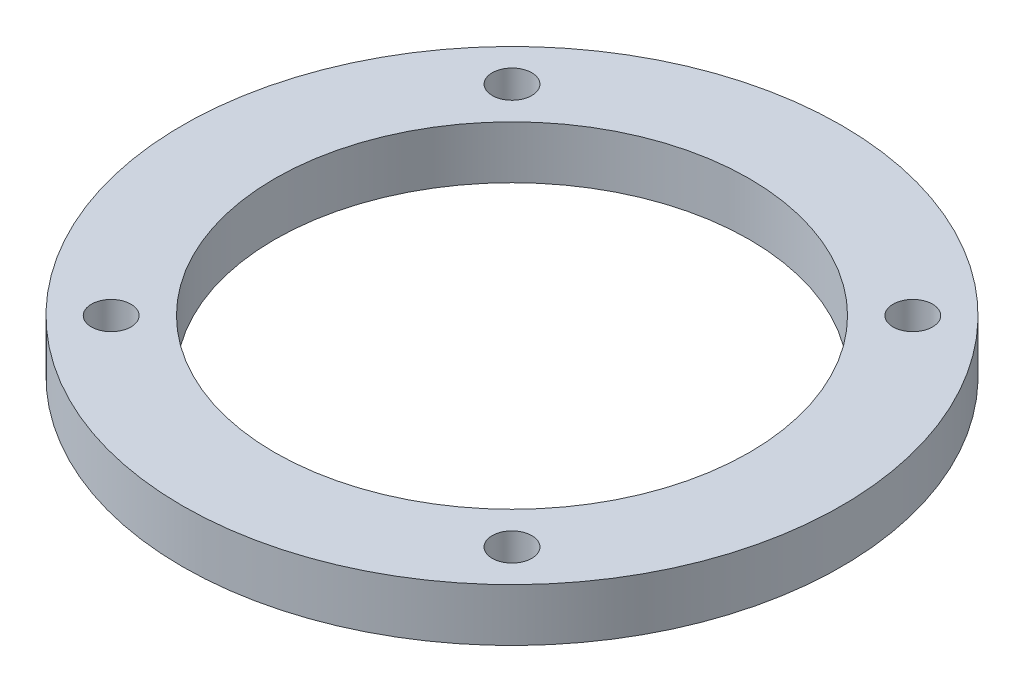
ISO-10303-21;
HEADER;
FILE_DESCRIPTION(('STEP AP214'),'2;1');
FILE_NAME('part.step','',(''),(''),'','','');
FILE_SCHEMA(('AUTOMOTIVE_DESIGN { 1 0 10303 214 1 1 1 1 }'));
ENDSEC;
DATA;
#1=APPLICATION_CONTEXT('core data for automotive mechanical design processes');
#2=APPLICATION_PROTOCOL_DEFINITION('international standard','automotive_design',2000,#1);
#3=PRODUCT_CONTEXT('',#1,'mechanical');
#4=PRODUCT('Part','Part','',(#3));
#5=PRODUCT_RELATED_PRODUCT_CATEGORY('part','',(#4));
#6=PRODUCT_DEFINITION_FORMATION('','',#4);
#7=PRODUCT_DEFINITION_CONTEXT('part definition',#1,'design');
#8=PRODUCT_DEFINITION('design','',#6,#7);
#9=PRODUCT_DEFINITION_SHAPE('','',#8);
#10=(LENGTH_UNIT() NAMED_UNIT(*) SI_UNIT(.MILLI.,.METRE.));
#11=(NAMED_UNIT(*) PLANE_ANGLE_UNIT() SI_UNIT($,.RADIAN.));
#12=(NAMED_UNIT(*) SI_UNIT($,.STERADIAN.) SOLID_ANGLE_UNIT());
#13=UNCERTAINTY_MEASURE_WITH_UNIT(LENGTH_MEASURE(1.E-05),#10,'distance_accuracy_value','');
#14=(GEOMETRIC_REPRESENTATION_CONTEXT(3) GLOBAL_UNCERTAINTY_ASSIGNED_CONTEXT((#13)) GLOBAL_UNIT_ASSIGNED_CONTEXT((#10,
#11,#12)) REPRESENTATION_CONTEXT('',''));
#15=CARTESIAN_POINT('',(0.,0.,0.));
#16=DIRECTION('',(0.,0.,1.));
#17=DIRECTION('',(1.,0.,0.));
#18=AXIS2_PLACEMENT_3D('',#15,#16,#17);
#19=CARTESIAN_POINT('',(0.,0.,0.));
#20=DIRECTION('',(0.,1.,0.));
#21=DIRECTION('',(0.,0.,1.));
#22=AXIS2_PLACEMENT_3D('',#19,#20,#21);
#23=PLANE('',#22);
#24=CARTESIAN_POINT('',(0.,0.,0.));
#25=DIRECTION('',(0.,-1.,0.));
#26=DIRECTION('',(0.,0.,-1.));
#27=AXIS2_PLACEMENT_3D('',#24,#25,#26);
#28=CIRCLE('',#27,90.);
#29=CARTESIAN_POINT('',(0.,0.,-90.));
#30=VERTEX_POINT('',#29);
#31=EDGE_CURVE('E52',#30,#30,#28,.F.);
#32=ORIENTED_EDGE('',*,*,#31,.T.);
#33=EDGE_LOOP('',(#32));
#34=FACE_BOUND('',#33,.T.);
#35=CARTESIAN_POINT('',(0.,0.,0.));
#36=DIRECTION('',(0.,-1.,0.));
#37=DIRECTION('',(0.,0.,-1.));
#38=AXIS2_PLACEMENT_3D('',#35,#36,#37);
#39=CIRCLE('',#38,125.);
#40=CARTESIAN_POINT('',(0.,0.,-125.));
#41=VERTEX_POINT('',#40);
#42=EDGE_CURVE('E50',#41,#41,#39,.F.);
#43=ORIENTED_EDGE('',*,*,#42,.F.);
#44=EDGE_LOOP('',(#43));
#45=FACE_BOUND('',#44,.T.);
#46=CARTESIAN_POINT('',(-76.0139789775521,0.,-76.0139789775556));
#47=DIRECTION('',(0.,-1.,0.));
#48=DIRECTION('',(0.,0.,-1.));
#49=AXIS2_PLACEMENT_3D('',#46,#47,#48);
#50=CIRCLE('',#49,7.49999999999999);
#51=CARTESIAN_POINT('',(-76.0139789775521,0.,-83.5139789775556));
#52=VERTEX_POINT('',#51);
#53=EDGE_CURVE('E47',#52,#52,#50,.F.);
#54=ORIENTED_EDGE('',*,*,#53,.T.);
#55=EDGE_LOOP('',(#54));
#56=FACE_BOUND('',#55,.T.);
#57=CARTESIAN_POINT('',(-76.0139789775534,0.,76.0139789775521));
#58=DIRECTION('',(0.,-1.,0.));
#59=DIRECTION('',(0.,0.,-1.));
#60=AXIS2_PLACEMENT_3D('',#57,#58,#59);
#61=CIRCLE('',#60,7.49999999999999);
#62=CARTESIAN_POINT('',(-76.0139789775534,0.,68.5139789775521));
#63=VERTEX_POINT('',#62);
#64=EDGE_CURVE('E44',#63,#63,#61,.F.);
#65=ORIENTED_EDGE('',*,*,#64,.T.);
#66=EDGE_LOOP('',(#65));
#67=FACE_BOUND('',#66,.T.);
#68=CARTESIAN_POINT('',(76.0139789775542,0.,76.0139789775534));
#69=DIRECTION('',(0.,-1.,0.));
#70=DIRECTION('',(0.,0.,-1.));
#71=AXIS2_PLACEMENT_3D('',#68,#69,#70);
#72=CIRCLE('',#71,7.49999999999999);
#73=CARTESIAN_POINT('',(76.0139789775542,0.,68.5139789775535));
#74=VERTEX_POINT('',#73);
#75=EDGE_CURVE('E41',#74,#74,#72,.F.);
#76=ORIENTED_EDGE('',*,*,#75,.T.);
#77=EDGE_LOOP('',(#76));
#78=FACE_BOUND('',#77,.T.);
#79=CARTESIAN_POINT('',(76.0139789775556,0.,-76.0139789775542));
#80=DIRECTION('',(0.,-1.,0.));
#81=DIRECTION('',(0.,0.,-1.));
#82=AXIS2_PLACEMENT_3D('',#79,#80,#81);
#83=CIRCLE('',#82,7.49999999999999);
#84=CARTESIAN_POINT('',(76.0139789775556,0.,-83.5139789775542));
#85=VERTEX_POINT('',#84);
#86=EDGE_CURVE('E18',#85,#85,#83,.F.);
#87=ORIENTED_EDGE('',*,*,#86,.T.);
#88=EDGE_LOOP('',(#87));
#89=FACE_BOUND('',#88,.T.);
#90=ADVANCED_FACE('F15',(#34,#45,#56,#67,#78,#89),#23,.F.);
#91=CARTESIAN_POINT('',(76.0139789775556,0.,-76.0139789775542));
#92=DIRECTION('',(0.,-1.,0.));
#93=DIRECTION('',(0.,0.,-1.));
#94=AXIS2_PLACEMENT_3D('',#91,#92,#93);
#95=CYLINDRICAL_SURFACE('',#94,7.49999999999999);
#96=ORIENTED_EDGE('',*,*,#86,.F.);
#97=EDGE_LOOP('',(#96));
#98=FACE_BOUND('',#97,.T.);
#99=CARTESIAN_POINT('',(76.0139789775556,20.,-76.0139789775542));
#100=DIRECTION('',(0.,-1.,0.));
#101=DIRECTION('',(0.,0.,-1.));
#102=AXIS2_PLACEMENT_3D('',#99,#100,#101);
#103=CIRCLE('',#102,7.49999999999999);
#104=CARTESIAN_POINT('',(76.0139789775556,20.,-83.5139789775542));
#105=VERTEX_POINT('',#104);
#106=EDGE_CURVE('E38',#105,#105,#103,.T.);
#107=ORIENTED_EDGE('',*,*,#106,.F.);
#108=EDGE_LOOP('',(#107));
#109=FACE_BOUND('',#108,.T.);
#110=ADVANCED_FACE('F60',(#98,#109),#95,.F.);
#111=CARTESIAN_POINT('',(0.,20.,0.));
#112=DIRECTION('',(0.,-1.,0.));
#113=DIRECTION('',(0.,0.,-1.));
#114=AXIS2_PLACEMENT_3D('',#111,#112,#113);
#115=CYLINDRICAL_SURFACE('',#114,90.);
#116=CARTESIAN_POINT('',(0.,20.,0.));
#117=DIRECTION('',(0.,-1.,0.));
#118=DIRECTION('',(0.,0.,-1.));
#119=AXIS2_PLACEMENT_3D('',#116,#117,#118);
#120=CIRCLE('',#119,90.);
#121=CARTESIAN_POINT('',(0.,20.,-90.));
#122=VERTEX_POINT('',#121);
#123=EDGE_CURVE('E35',#122,#122,#120,.T.);
#124=ORIENTED_EDGE('',*,*,#123,.F.);
#125=EDGE_LOOP('',(#124));
#126=FACE_BOUND('',#125,.T.);
#127=ORIENTED_EDGE('',*,*,#31,.F.);
#128=EDGE_LOOP('',(#127));
#129=FACE_BOUND('',#128,.T.);
#130=ADVANCED_FACE('F63',(#126,#129),#115,.F.);
#131=CARTESIAN_POINT('',(0.,20.,0.));
#132=DIRECTION('',(0.,-1.,0.));
#133=DIRECTION('',(0.,0.,-1.));
#134=AXIS2_PLACEMENT_3D('',#131,#132,#133);
#135=CYLINDRICAL_SURFACE('',#134,125.);
#136=ORIENTED_EDGE('',*,*,#42,.T.);
#137=EDGE_LOOP('',(#136));
#138=FACE_BOUND('',#137,.T.);
#139=CARTESIAN_POINT('',(0.,20.,0.));
#140=DIRECTION('',(0.,-1.,0.));
#141=DIRECTION('',(0.,0.,-1.));
#142=AXIS2_PLACEMENT_3D('',#139,#140,#141);
#143=CIRCLE('',#142,125.);
#144=CARTESIAN_POINT('',(0.,20.,-125.));
#145=VERTEX_POINT('',#144);
#146=EDGE_CURVE('E32',#145,#145,#143,.F.);
#147=ORIENTED_EDGE('',*,*,#146,.F.);
#148=EDGE_LOOP('',(#147));
#149=FACE_BOUND('',#148,.T.);
#150=ADVANCED_FACE('F85',(#138,#149),#135,.T.);
#151=CARTESIAN_POINT('',(-76.0139789775521,0.,-76.0139789775556));
#152=DIRECTION('',(0.,-1.,0.));
#153=DIRECTION('',(0.,0.,-1.));
#154=AXIS2_PLACEMENT_3D('',#151,#152,#153);
#155=CYLINDRICAL_SURFACE('',#154,7.49999999999999);
#156=ORIENTED_EDGE('',*,*,#53,.F.);
#157=EDGE_LOOP('',(#156));
#158=FACE_BOUND('',#157,.T.);
#159=CARTESIAN_POINT('',(-76.0139789775521,20.,-76.0139789775556));
#160=DIRECTION('',(0.,-1.,0.));
#161=DIRECTION('',(0.,0.,-1.));
#162=AXIS2_PLACEMENT_3D('',#159,#160,#161);
#163=CIRCLE('',#162,7.49999999999999);
#164=CARTESIAN_POINT('',(-76.0139789775521,20.,-83.5139789775556));
#165=VERTEX_POINT('',#164);
#166=EDGE_CURVE('E27',#165,#165,#163,.T.);
#167=ORIENTED_EDGE('',*,*,#166,.F.);
#168=EDGE_LOOP('',(#167));
#169=FACE_BOUND('',#168,.T.);
#170=ADVANCED_FACE('F81',(#158,#169),#155,.F.);
#171=CARTESIAN_POINT('',(-76.0139789775534,0.,76.0139789775521));
#172=DIRECTION('',(0.,-1.,0.));
#173=DIRECTION('',(0.,0.,-1.));
#174=AXIS2_PLACEMENT_3D('',#171,#172,#173);
#175=CYLINDRICAL_SURFACE('',#174,7.49999999999999);
#176=ORIENTED_EDGE('',*,*,#64,.F.);
#177=EDGE_LOOP('',(#176));
#178=FACE_BOUND('',#177,.T.);
#179=CARTESIAN_POINT('',(-76.0139789775534,20.,76.0139789775521));
#180=DIRECTION('',(0.,-1.,0.));
#181=DIRECTION('',(0.,0.,-1.));
#182=AXIS2_PLACEMENT_3D('',#179,#180,#181);
#183=CIRCLE('',#182,7.49999999999999);
#184=CARTESIAN_POINT('',(-76.0139789775534,20.,68.5139789775521));
#185=VERTEX_POINT('',#184);
#186=EDGE_CURVE('E22',#185,#185,#183,.T.);
#187=ORIENTED_EDGE('',*,*,#186,.F.);
#188=EDGE_LOOP('',(#187));
#189=FACE_BOUND('',#188,.T.);
#190=ADVANCED_FACE('F74',(#178,#189),#175,.F.);
#191=CARTESIAN_POINT('',(76.0139789775542,0.,76.0139789775534));
#192=DIRECTION('',(0.,-1.,0.));
#193=DIRECTION('',(0.,0.,-1.));
#194=AXIS2_PLACEMENT_3D('',#191,#192,#193);
#195=CYLINDRICAL_SURFACE('',#194,7.49999999999999);
#196=ORIENTED_EDGE('',*,*,#75,.F.);
#197=EDGE_LOOP('',(#196));
#198=FACE_BOUND('',#197,.T.);
#199=CARTESIAN_POINT('',(76.0139789775542,20.,76.0139789775534));
#200=DIRECTION('',(0.,-1.,0.));
#201=DIRECTION('',(0.,0.,-1.));
#202=AXIS2_PLACEMENT_3D('',#199,#200,#201);
#203=CIRCLE('',#202,7.49999999999999);
#204=CARTESIAN_POINT('',(76.0139789775542,20.,68.5139789775535));
#205=VERTEX_POINT('',#204);
#206=EDGE_CURVE('E10',#205,#205,#203,.T.);
#207=ORIENTED_EDGE('',*,*,#206,.F.);
#208=EDGE_LOOP('',(#207));
#209=FACE_BOUND('',#208,.T.);
#210=ADVANCED_FACE('F68',(#198,#209),#195,.F.);
#211=CARTESIAN_POINT('',(0.,20.,0.));
#212=DIRECTION('',(0.,1.,0.));
#213=DIRECTION('',(0.,0.,1.));
#214=AXIS2_PLACEMENT_3D('',#211,#212,#213);
#215=PLANE('',#214);
#216=ORIENTED_EDGE('',*,*,#206,.T.);
#217=EDGE_LOOP('',(#216));
#218=FACE_BOUND('',#217,.T.);
#219=ORIENTED_EDGE('',*,*,#186,.T.);
#220=EDGE_LOOP('',(#219));
#221=FACE_BOUND('',#220,.T.);
#222=ORIENTED_EDGE('',*,*,#166,.T.);
#223=EDGE_LOOP('',(#222));
#224=FACE_BOUND('',#223,.T.);
#225=ORIENTED_EDGE('',*,*,#146,.T.);
#226=EDGE_LOOP('',(#225));
#227=FACE_BOUND('',#226,.T.);
#228=ORIENTED_EDGE('',*,*,#123,.T.);
#229=EDGE_LOOP('',(#228));
#230=FACE_BOUND('',#229,.T.);
#231=ORIENTED_EDGE('',*,*,#106,.T.);
#232=EDGE_LOOP('',(#231));
#233=FACE_BOUND('',#232,.T.);
#234=ADVANCED_FACE('F66',(#218,#221,#224,#227,#230,#233),#215,.T.);
#235=CLOSED_SHELL('',(#90,#110,#130,#150,#170,#190,#210,#234));
#236=MANIFOLD_SOLID_BREP('B1',#235);
#237=ADVANCED_BREP_SHAPE_REPRESENTATION('',(#18,#236),#14);
#238=SHAPE_DEFINITION_REPRESENTATION(#9,#237);
ENDSEC;
END-ISO-10303-21;
